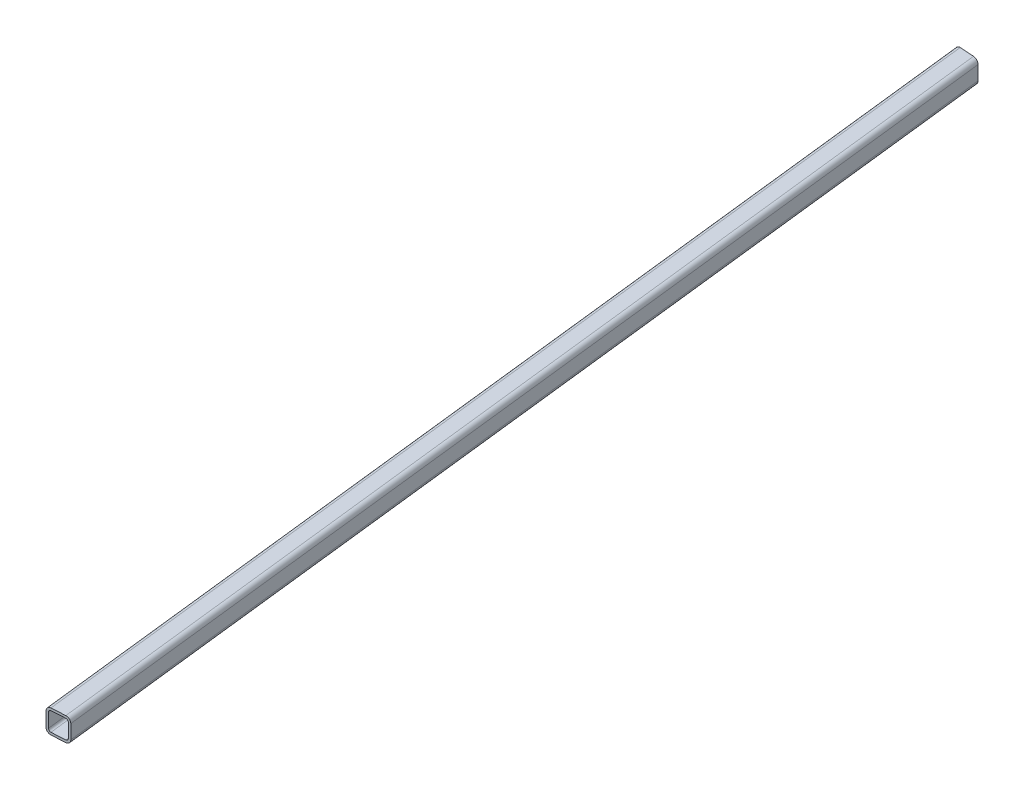
ISO-10303-21;
HEADER;
FILE_DESCRIPTION(('STEP AP214'),'2;1');
FILE_NAME('part.step','',(''),(''),'','','');
FILE_SCHEMA(('AUTOMOTIVE_DESIGN { 1 0 10303 214 1 1 1 1 }'));
ENDSEC;
DATA;
#1=APPLICATION_CONTEXT('core data for automotive mechanical design processes');
#2=APPLICATION_PROTOCOL_DEFINITION('international standard','automotive_design',2000,#1);
#3=PRODUCT_CONTEXT('',#1,'mechanical');
#4=PRODUCT('Part','Part','',(#3));
#5=PRODUCT_RELATED_PRODUCT_CATEGORY('part','',(#4));
#6=PRODUCT_DEFINITION_FORMATION('','',#4);
#7=PRODUCT_DEFINITION_CONTEXT('part definition',#1,'design');
#8=PRODUCT_DEFINITION('design','',#6,#7);
#9=PRODUCT_DEFINITION_SHAPE('','',#8);
#10=(LENGTH_UNIT() NAMED_UNIT(*) SI_UNIT(.MILLI.,.METRE.));
#11=(NAMED_UNIT(*) PLANE_ANGLE_UNIT() SI_UNIT($,.RADIAN.));
#12=(NAMED_UNIT(*) SI_UNIT($,.STERADIAN.) SOLID_ANGLE_UNIT());
#13=UNCERTAINTY_MEASURE_WITH_UNIT(LENGTH_MEASURE(1.E-05),#10,'distance_accuracy_value','');
#14=(GEOMETRIC_REPRESENTATION_CONTEXT(3) GLOBAL_UNCERTAINTY_ASSIGNED_CONTEXT((#13)) GLOBAL_UNIT_ASSIGNED_CONTEXT((#10,
#11,#12)) REPRESENTATION_CONTEXT('',''));
#15=CARTESIAN_POINT('',(0.,0.,0.));
#16=DIRECTION('',(0.,0.,1.));
#17=DIRECTION('',(1.,0.,0.));
#18=AXIS2_PLACEMENT_3D('',#15,#16,#17);
#19=CARTESIAN_POINT('',(-255.961196035939,6.00000000000001,-1699.31872045304));
#20=DIRECTION('',(0.113546591160732,0.,0.993532672656404));
#21=DIRECTION('',(0.993532672656404,0.,-0.113546591160732));
#22=AXIS2_PLACEMENT_3D('',#19,#20,#21);
#23=CYLINDRICAL_SURFACE('',#22,4.);
#24=CARTESIAN_POINT('',(-156.,6.00000000000001,-824.658255138574));
#25=DIRECTION('',(0.056865311674147,0.,0.998381858973911));
#26=DIRECTION('',(0.998381858973911,0.,-0.056865311674147));
#27=AXIS2_PLACEMENT_3D('',#24,#25,#26);
#28=ELLIPSE('',#27,4.00648305460098,4.);
#29=CARTESIAN_POINT('',(-156.,10.,-824.658255138574));
#30=VERTEX_POINT('',#29);
#31=CARTESIAN_POINT('',(-160.,6.,-824.430425230957));
#32=VERTEX_POINT('',#31);
#33=EDGE_CURVE('E185',#30,#32,#28,.T.);
#34=ORIENTED_EDGE('',*,*,#33,.F.);
#35=DIRECTION('',(0.113546591160732,0.,0.993532672656404));
#36=VECTOR('',#35,1.);
#37=CARTESIAN_POINT('',(-255.961196035939,10.,-1699.31872045304));
#38=LINE('',#37,#36);
#39=CARTESIAN_POINT('',(-256.084735577657,10.,-1700.39969144308));
#40=VERTEX_POINT('',#39);
#41=EDGE_CURVE('E265',#40,#30,#38,.T.);
#42=ORIENTED_EDGE('',*,*,#41,.F.);
#43=CARTESIAN_POINT('',(-256.084735577657,6.00000000000001,-1700.39969144308));
#44=DIRECTION('',(0.0655463023942974,0.,-0.997849528858152));
#45=DIRECTION('',(0.997849528858152,0.,0.0655463023942974));
#46=AXIS2_PLACEMENT_3D('',#43,#44,#45);
#47=ELLIPSE('',#46,4.06523255038944,4.);
#48=CARTESIAN_POINT('',(-260.141225962762,6.,-1700.66615240513));
#49=VERTEX_POINT('',#48);
#50=EDGE_CURVE('E176',#49,#40,#47,.T.);
#51=ORIENTED_EDGE('',*,*,#50,.F.);
#52=DIRECTION('',(0.113546591160732,0.,0.993532672656404));
#53=VECTOR('',#52,1.);
#54=CARTESIAN_POINT('',(-259.935326726564,6.00000000000001,-1698.86453408839));
#55=LINE('',#54,#53);
#56=EDGE_CURVE('E45',#49,#32,#55,.T.);
#57=ORIENTED_EDGE('',*,*,#56,.T.);
#58=EDGE_LOOP('',(#34,#42,#51,#57));
#59=FACE_BOUND('',#58,.T.);
#60=ADVANCED_FACE('F41',(#59),#23,.T.);
#61=CARTESIAN_POINT('',(-255.961196035939,10.,-1699.31872045304));
#62=DIRECTION('',(0.,-1.,0.));
#63=DIRECTION('',(0.,0.,-1.));
#64=AXIS2_PLACEMENT_3D('',#61,#62,#63);
#65=PLANE('',#64);
#66=DIRECTION('',(-0.998381858973911,0.,0.056865311674147));
#67=VECTOR('',#66,1.);
#68=CARTESIAN_POINT('',(-205.980598017969,10.,-821.811486381304));
#69=LINE('',#68,#67);
#70=CARTESIAN_POINT('',(-144.,10.,-825.341744861426));
#71=VERTEX_POINT('',#70);
#72=EDGE_CURVE('E182',#71,#30,#69,.T.);
#73=ORIENTED_EDGE('',*,*,#72,.F.);
#74=DIRECTION('',(0.113546591160732,0.,0.993532672656404));
#75=VECTOR('',#74,1.);
#76=CARTESIAN_POINT('',(-244.038803964062,10.,-1700.68127954697));
#77=LINE('',#76,#75);
#78=CARTESIAN_POINT('',(-243.915264422343,10.,-1699.60030855692));
#79=VERTEX_POINT('',#78);
#80=EDGE_CURVE('E263',#79,#71,#77,.T.);
#81=ORIENTED_EDGE('',*,*,#80,.F.);
#82=DIRECTION('',(0.997849528858152,0.,0.0655463023942974));
#83=VECTOR('',#82,1.);
#84=CARTESIAN_POINT('',(-255.891025518405,10.,-1700.38696710163));
#85=LINE('',#84,#83);
#86=EDGE_CURVE('E281',#40,#79,#85,.T.);
#87=ORIENTED_EDGE('',*,*,#86,.F.);
#88=ORIENTED_EDGE('',*,*,#41,.T.);
#89=EDGE_LOOP('',(#73,#81,#87,#88));
#90=FACE_BOUND('',#89,.T.);
#91=ADVANCED_FACE('F272',(#90),#65,.F.);
#92=CARTESIAN_POINT('',(-244.038803964062,6.00000000000001,-1700.68127954697));
#93=DIRECTION('',(0.113546591160732,0.,0.993532672656404));
#94=DIRECTION('',(0.993532672656404,0.,-0.113546591160732));
#95=AXIS2_PLACEMENT_3D('',#92,#93,#94);
#96=CYLINDRICAL_SURFACE('',#95,4.);
#97=CARTESIAN_POINT('',(-144.,6.00000000000001,-825.341744861426));
#98=DIRECTION('',(0.056865311674147,0.,0.998381858973911));
#99=DIRECTION('',(0.998381858973911,0.,-0.056865311674147));
#100=AXIS2_PLACEMENT_3D('',#97,#98,#99);
#101=ELLIPSE('',#100,4.00648305460098,4.);
#102=CARTESIAN_POINT('',(-140.,6.00000000000001,-825.569574769042));
#103=VERTEX_POINT('',#102);
#104=EDGE_CURVE('E11',#103,#71,#101,.T.);
#105=ORIENTED_EDGE('',*,*,#104,.F.);
#106=DIRECTION('',(0.113546591160732,0.,0.993532672656404));
#107=VECTOR('',#106,1.);
#108=CARTESIAN_POINT('',(-240.064673273436,6.00000000000001,-1701.13546591161));
#109=LINE('',#108,#107);
#110=CARTESIAN_POINT('',(-239.858774037238,6.00000000000001,-1699.33384759487));
#111=VERTEX_POINT('',#110);
#112=EDGE_CURVE('E260',#111,#103,#109,.T.);
#113=ORIENTED_EDGE('',*,*,#112,.F.);
#114=CARTESIAN_POINT('',(-243.915264422343,6.00000000000001,-1699.60030855692));
#115=DIRECTION('',(0.0655463023942974,0.,-0.997849528858152));
#116=DIRECTION('',(0.997849528858152,0.,0.0655463023942974));
#117=AXIS2_PLACEMENT_3D('',#114,#115,#116);
#118=ELLIPSE('',#117,4.06523255038944,4.);
#119=EDGE_CURVE('E278',#79,#111,#118,.T.);
#120=ORIENTED_EDGE('',*,*,#119,.F.);
#121=ORIENTED_EDGE('',*,*,#80,.T.);
#122=EDGE_LOOP('',(#105,#113,#120,#121));
#123=FACE_BOUND('',#122,.T.);
#124=ADVANCED_FACE('F275',(#123),#96,.T.);
#125=CARTESIAN_POINT('',(-240.064673273436,-6.00000000000001,-1701.13546591161));
#126=DIRECTION('',(-0.993532672656404,0.,0.113546591160732));
#127=DIRECTION('',(0.113546591160732,0.,0.993532672656404));
#128=AXIS2_PLACEMENT_3D('',#125,#126,#127);
#129=PLANE('',#128);
#130=DIRECTION('',(0.,1.,0.));
#131=VECTOR('',#130,1.);
#132=CARTESIAN_POINT('',(-140.,-6.,-825.569574769043));
#133=LINE('',#132,#131);
#134=CARTESIAN_POINT('',(-140.,-6.,-825.569574769043));
#135=VERTEX_POINT('',#134);
#136=EDGE_CURVE('E51',#135,#103,#133,.T.);
#137=ORIENTED_EDGE('',*,*,#136,.F.);
#138=DIRECTION('',(0.113546591160732,0.,0.993532672656404));
#139=VECTOR('',#138,1.);
#140=CARTESIAN_POINT('',(-240.064673273436,-6.00000000000001,-1701.13546591161));
#141=LINE('',#140,#139);
#142=CARTESIAN_POINT('',(-239.858774037238,-6.00000000000001,-1699.33384759487));
#143=VERTEX_POINT('',#142);
#144=EDGE_CURVE('E257',#143,#135,#141,.T.);
#145=ORIENTED_EDGE('',*,*,#144,.F.);
#146=DIRECTION('',(0.,-1.,0.));
#147=VECTOR('',#146,1.);
#148=CARTESIAN_POINT('',(-239.858774037238,-6.00000000000001,-1699.33384759487));
#149=LINE('',#148,#147);
#150=EDGE_CURVE('E280',#111,#143,#149,.T.);
#151=ORIENTED_EDGE('',*,*,#150,.F.);
#152=ORIENTED_EDGE('',*,*,#112,.T.);
#153=EDGE_LOOP('',(#137,#145,#151,#152));
#154=FACE_BOUND('',#153,.T.);
#155=ADVANCED_FACE('F291',(#154),#129,.F.);
#156=CARTESIAN_POINT('',(-244.038803964062,-6.00000000000001,-1700.68127954697));
#157=DIRECTION('',(0.113546591160732,0.,0.993532672656404));
#158=DIRECTION('',(0.993532672656404,0.,-0.113546591160732));
#159=AXIS2_PLACEMENT_3D('',#156,#157,#158);
#160=CYLINDRICAL_SURFACE('',#159,4.);
#161=CARTESIAN_POINT('',(-144.,-6.00000000000001,-825.341744861426));
#162=DIRECTION('',(0.056865311674147,0.,0.998381858973911));
#163=DIRECTION('',(0.998381858973911,0.,-0.056865311674147));
#164=AXIS2_PLACEMENT_3D('',#161,#162,#163);
#165=ELLIPSE('',#164,4.00648305460098,4.);
#166=CARTESIAN_POINT('',(-144.,-10.,-825.341744861426));
#167=VERTEX_POINT('',#166);
#168=EDGE_CURVE('E200',#167,#135,#165,.T.);
#169=ORIENTED_EDGE('',*,*,#168,.F.);
#170=DIRECTION('',(0.113546591160732,0.,0.993532672656404));
#171=VECTOR('',#170,1.);
#172=CARTESIAN_POINT('',(-244.038803964062,-10.,-1700.68127954697));
#173=LINE('',#172,#171);
#174=CARTESIAN_POINT('',(-243.915264422343,-10.,-1699.60030855692));
#175=VERTEX_POINT('',#174);
#176=EDGE_CURVE('E254',#175,#167,#173,.T.);
#177=ORIENTED_EDGE('',*,*,#176,.F.);
#178=CARTESIAN_POINT('',(-243.915264422343,-6.,-1699.60030855692));
#179=DIRECTION('',(0.0655463023942974,0.,-0.997849528858152));
#180=DIRECTION('',(0.997849528858152,0.,0.0655463023942974));
#181=AXIS2_PLACEMENT_3D('',#178,#179,#180);
#182=ELLIPSE('',#181,4.06523255038944,4.);
#183=EDGE_CURVE('E187',#143,#175,#182,.T.);
#184=ORIENTED_EDGE('',*,*,#183,.F.);
#185=ORIENTED_EDGE('',*,*,#144,.T.);
#186=EDGE_LOOP('',(#169,#177,#184,#185));
#187=FACE_BOUND('',#186,.T.);
#188=ADVANCED_FACE('F289',(#187),#160,.T.);
#189=CARTESIAN_POINT('',(-244.038803964062,-10.,-1700.68127954697));
#190=DIRECTION('',(0.,1.,0.));
#191=DIRECTION('',(0.,0.,1.));
#192=AXIS2_PLACEMENT_3D('',#189,#190,#191);
#193=PLANE('',#192);
#194=DIRECTION('',(0.998381858973911,0.,-0.056865311674147));
#195=VECTOR('',#194,1.);
#196=CARTESIAN_POINT('',(-194.019401982031,-10.,-822.492765928269));
#197=LINE('',#196,#195);
#198=CARTESIAN_POINT('',(-156.,-10.,-824.658255138574));
#199=VERTEX_POINT('',#198);
#200=EDGE_CURVE('E203',#199,#167,#197,.T.);
#201=ORIENTED_EDGE('',*,*,#200,.F.);
#202=DIRECTION('',(0.113546591160732,0.,0.993532672656404));
#203=VECTOR('',#202,1.);
#204=CARTESIAN_POINT('',(-255.961196035939,-10.,-1699.31872045304));
#205=LINE('',#204,#203);
#206=CARTESIAN_POINT('',(-256.084735577657,-10.,-1700.39969144308));
#207=VERTEX_POINT('',#206);
#208=EDGE_CURVE('E252',#207,#199,#205,.T.);
#209=ORIENTED_EDGE('',*,*,#208,.F.);
#210=DIRECTION('',(-0.997849528858152,0.,-0.0655463023942974));
#211=VECTOR('',#210,1.);
#212=CARTESIAN_POINT('',(-244.108974481595,-10.,-1699.61303289837));
#213=LINE('',#212,#211);
#214=EDGE_CURVE('E181',#175,#207,#213,.T.);
#215=ORIENTED_EDGE('',*,*,#214,.F.);
#216=ORIENTED_EDGE('',*,*,#176,.T.);
#217=EDGE_LOOP('',(#201,#209,#215,#216));
#218=FACE_BOUND('',#217,.T.);
#219=ADVANCED_FACE('F293',(#218),#193,.F.);
#220=CARTESIAN_POINT('',(-255.961196035939,-6.00000000000001,-1699.31872045304));
#221=DIRECTION('',(0.113546591160732,0.,0.993532672656404));
#222=DIRECTION('',(0.993532672656404,0.,-0.113546591160732));
#223=AXIS2_PLACEMENT_3D('',#220,#221,#222);
#224=CYLINDRICAL_SURFACE('',#223,4.);
#225=CARTESIAN_POINT('',(-156.,-6.00000000000001,-824.658255138574));
#226=DIRECTION('',(0.056865311674147,0.,0.998381858973911));
#227=DIRECTION('',(0.998381858973911,0.,-0.056865311674147));
#228=AXIS2_PLACEMENT_3D('',#225,#226,#227);
#229=ELLIPSE('',#228,4.00648305460098,4.);
#230=CARTESIAN_POINT('',(-160.,-6.00000000000001,-824.430425230957));
#231=VERTEX_POINT('',#230);
#232=EDGE_CURVE('E164',#231,#199,#229,.T.);
#233=ORIENTED_EDGE('',*,*,#232,.F.);
#234=DIRECTION('',(0.113546591160732,0.,0.993532672656404));
#235=VECTOR('',#234,1.);
#236=CARTESIAN_POINT('',(-259.935326726564,-6.00000000000001,-1698.86453408839));
#237=LINE('',#236,#235);
#238=CARTESIAN_POINT('',(-260.141225962762,-6.00000000000001,-1700.66615240513));
#239=VERTEX_POINT('',#238);
#240=EDGE_CURVE('E156',#239,#231,#237,.T.);
#241=ORIENTED_EDGE('',*,*,#240,.F.);
#242=CARTESIAN_POINT('',(-256.084735577657,-6.00000000000001,-1700.39969144308));
#243=DIRECTION('',(0.0655463023942974,0.,-0.997849528858152));
#244=DIRECTION('',(0.997849528858152,0.,0.0655463023942974));
#245=AXIS2_PLACEMENT_3D('',#242,#243,#244);
#246=ELLIPSE('',#245,4.06523255038944,4.);
#247=EDGE_CURVE('E161',#207,#239,#246,.T.);
#248=ORIENTED_EDGE('',*,*,#247,.F.);
#249=ORIENTED_EDGE('',*,*,#208,.T.);
#250=EDGE_LOOP('',(#233,#241,#248,#249));
#251=FACE_BOUND('',#250,.T.);
#252=ADVANCED_FACE('F158',(#251),#224,.T.);
#253=CARTESIAN_POINT('',(-244.038803964062,6.00000000000001,-1700.68127954697));
#254=DIRECTION('',(0.113546591160732,0.,0.993532672656404));
#255=DIRECTION('',(0.993532672656404,0.,-0.113546591160732));
#256=AXIS2_PLACEMENT_3D('',#253,#254,#255);
#257=CYLINDRICAL_SURFACE('',#256,2.);
#258=DIRECTION('',(0.113546591160732,0.,0.993532672656404));
#259=VECTOR('',#258,1.);
#260=CARTESIAN_POINT('',(-242.051738618749,6.00000000000001,-1700.90837272929));
#261=LINE('',#260,#259);
#262=CARTESIAN_POINT('',(-241.88701922979,6.,-1699.4670780759));
#263=VERTEX_POINT('',#262);
#264=CARTESIAN_POINT('',(-142.,6.00000000000001,-825.455659815234));
#265=VERTEX_POINT('',#264);
#266=EDGE_CURVE('E209',#263,#265,#261,.T.);
#267=ORIENTED_EDGE('',*,*,#266,.T.);
#268=CARTESIAN_POINT('',(-144.,6.00000000000001,-825.341744861426));
#269=DIRECTION('',(0.056865311674147,0.,0.998381858973911));
#270=DIRECTION('',(0.998381858973911,0.,-0.056865311674147));
#271=AXIS2_PLACEMENT_3D('',#268,#269,#270);
#272=ELLIPSE('',#271,2.00324152730049,2.);
#273=CARTESIAN_POINT('',(-144.,8.00000000000001,-825.341744861426));
#274=VERTEX_POINT('',#273);
#275=EDGE_CURVE('E87',#265,#274,#272,.T.);
#276=ORIENTED_EDGE('',*,*,#275,.T.);
#277=DIRECTION('',(0.113546591160732,0.,0.993532672656404));
#278=VECTOR('',#277,1.);
#279=CARTESIAN_POINT('',(-244.038803964062,8.00000000000001,-1700.68127954697));
#280=LINE('',#279,#278);
#281=CARTESIAN_POINT('',(-243.915264422343,8.00000000000001,-1699.60030855692));
#282=VERTEX_POINT('',#281);
#283=EDGE_CURVE('E212',#282,#274,#280,.T.);
#284=ORIENTED_EDGE('',*,*,#283,.F.);
#285=CARTESIAN_POINT('',(-243.915264422343,6.00000000000001,-1699.60030855692));
#286=DIRECTION('',(0.0655463023942974,0.,-0.997849528858152));
#287=DIRECTION('',(0.997849528858152,0.,0.0655463023942974));
#288=AXIS2_PLACEMENT_3D('',#285,#286,#287);
#289=ELLIPSE('',#288,2.03261627519472,2.);
#290=EDGE_CURVE('E208',#282,#263,#289,.T.);
#291=ORIENTED_EDGE('',*,*,#290,.T.);
#292=EDGE_LOOP('',(#267,#276,#284,#291));
#293=FACE_BOUND('',#292,.T.);
#294=ADVANCED_FACE('F300',(#293),#257,.F.);
#295=CARTESIAN_POINT('',(-255.961196035939,8.00000000000001,-1699.31872045304));
#296=DIRECTION('',(0.,-1.,0.));
#297=DIRECTION('',(0.,0.,-1.));
#298=AXIS2_PLACEMENT_3D('',#295,#296,#297);
#299=PLANE('',#298);
#300=ORIENTED_EDGE('',*,*,#283,.T.);
#301=DIRECTION('',(-0.998381858973911,0.,0.056865311674147));
#302=VECTOR('',#301,1.);
#303=CARTESIAN_POINT('',(-205.980598017969,8.00000000000001,-821.811486381304));
#304=LINE('',#303,#302);
#305=CARTESIAN_POINT('',(-156.,8.00000000000001,-824.658255138574));
#306=VERTEX_POINT('',#305);
#307=EDGE_CURVE('E60',#274,#306,#304,.T.);
#308=ORIENTED_EDGE('',*,*,#307,.T.);
#309=DIRECTION('',(0.113546591160732,0.,0.993532672656404));
#310=VECTOR('',#309,1.);
#311=CARTESIAN_POINT('',(-255.961196035939,8.00000000000001,-1699.31872045304));
#312=LINE('',#311,#310);
#313=CARTESIAN_POINT('',(-256.084735577657,8.00000000000001,-1700.39969144308));
#314=VERTEX_POINT('',#313);
#315=EDGE_CURVE('E217',#314,#306,#312,.T.);
#316=ORIENTED_EDGE('',*,*,#315,.F.);
#317=DIRECTION('',(0.997849528858152,0.,0.0655463023942974));
#318=VECTOR('',#317,1.);
#319=CARTESIAN_POINT('',(-255.891025518405,8.00000000000001,-1700.38696710163));
#320=LINE('',#319,#318);
#321=EDGE_CURVE('E211',#314,#282,#320,.T.);
#322=ORIENTED_EDGE('',*,*,#321,.T.);
#323=EDGE_LOOP('',(#300,#308,#316,#322));
#324=FACE_BOUND('',#323,.T.);
#325=ADVANCED_FACE('F342',(#324),#299,.T.);
#326=CARTESIAN_POINT('',(-255.961196035939,6.00000000000001,-1699.31872045304));
#327=DIRECTION('',(0.113546591160732,0.,0.993532672656404));
#328=DIRECTION('',(0.993532672656404,0.,-0.113546591160732));
#329=AXIS2_PLACEMENT_3D('',#326,#327,#328);
#330=CYLINDRICAL_SURFACE('',#329,2.);
#331=ORIENTED_EDGE('',*,*,#315,.T.);
#332=CARTESIAN_POINT('',(-156.,6.00000000000001,-824.658255138574));
#333=DIRECTION('',(0.056865311674147,0.,0.998381858973911));
#334=DIRECTION('',(0.998381858973911,0.,-0.056865311674147));
#335=AXIS2_PLACEMENT_3D('',#332,#333,#334);
#336=ELLIPSE('',#335,2.00324152730049,2.);
#337=CARTESIAN_POINT('',(-158.,6.00000000000001,-824.544340184766));
#338=VERTEX_POINT('',#337);
#339=EDGE_CURVE('E213',#306,#338,#336,.T.);
#340=ORIENTED_EDGE('',*,*,#339,.T.);
#341=DIRECTION('',(0.113546591160732,0.,0.993532672656404));
#342=VECTOR('',#341,1.);
#343=CARTESIAN_POINT('',(-257.948261381251,6.00000000000001,-1699.09162727071));
#344=LINE('',#343,#342);
#345=CARTESIAN_POINT('',(-258.11298077021,6.00000000000001,-1700.5329219241));
#346=VERTEX_POINT('',#345);
#347=EDGE_CURVE('E222',#346,#338,#344,.T.);
#348=ORIENTED_EDGE('',*,*,#347,.F.);
#349=CARTESIAN_POINT('',(-256.084735577657,6.00000000000001,-1700.39969144308));
#350=DIRECTION('',(0.0655463023942974,0.,-0.997849528858152));
#351=DIRECTION('',(0.997849528858152,0.,0.0655463023942974));
#352=AXIS2_PLACEMENT_3D('',#349,#350,#351);
#353=ELLIPSE('',#352,2.03261627519472,2.);
#354=EDGE_CURVE('E216',#346,#314,#353,.T.);
#355=ORIENTED_EDGE('',*,*,#354,.T.);
#356=EDGE_LOOP('',(#331,#340,#348,#355));
#357=FACE_BOUND('',#356,.T.);
#358=ADVANCED_FACE('F352',(#357),#330,.F.);
#359=CARTESIAN_POINT('',(-257.948261381251,6.00000000000001,-1699.09162727071));
#360=DIRECTION('',(0.993532672656404,0.,-0.113546591160732));
#361=DIRECTION('',(-0.113546591160732,0.,-0.993532672656404));
#362=AXIS2_PLACEMENT_3D('',#359,#360,#361);
#363=PLANE('',#362);
#364=ORIENTED_EDGE('',*,*,#347,.T.);
#365=DIRECTION('',(0.,-1.,0.));
#366=VECTOR('',#365,1.);
#367=CARTESIAN_POINT('',(-158.,6.00000000000001,-824.544340184766));
#368=LINE('',#367,#366);
#369=CARTESIAN_POINT('',(-158.,-6.00000000000001,-824.544340184766));
#370=VERTEX_POINT('',#369);
#371=EDGE_CURVE('E218',#338,#370,#368,.T.);
#372=ORIENTED_EDGE('',*,*,#371,.T.);
#373=DIRECTION('',(0.113546591160732,0.,0.993532672656404));
#374=VECTOR('',#373,1.);
#375=CARTESIAN_POINT('',(-257.948261381251,-6.00000000000001,-1699.09162727071));
#376=LINE('',#375,#374);
#377=CARTESIAN_POINT('',(-258.11298077021,-6.00000000000001,-1700.5329219241));
#378=VERTEX_POINT('',#377);
#379=EDGE_CURVE('E227',#378,#370,#376,.T.);
#380=ORIENTED_EDGE('',*,*,#379,.F.);
#381=DIRECTION('',(0.,1.,0.));
#382=VECTOR('',#381,1.);
#383=CARTESIAN_POINT('',(-258.11298077021,6.00000000000001,-1700.5329219241));
#384=LINE('',#383,#382);
#385=EDGE_CURVE('E221',#378,#346,#384,.T.);
#386=ORIENTED_EDGE('',*,*,#385,.T.);
#387=EDGE_LOOP('',(#364,#372,#380,#386));
#388=FACE_BOUND('',#387,.T.);
#389=ADVANCED_FACE('F362',(#388),#363,.T.);
#390=CARTESIAN_POINT('',(-255.961196035939,-6.00000000000001,-1699.31872045304));
#391=DIRECTION('',(0.113546591160732,0.,0.993532672656404));
#392=DIRECTION('',(0.993532672656404,0.,-0.113546591160732));
#393=AXIS2_PLACEMENT_3D('',#390,#391,#392);
#394=CYLINDRICAL_SURFACE('',#393,2.);
#395=ORIENTED_EDGE('',*,*,#379,.T.);
#396=CARTESIAN_POINT('',(-156.,-6.00000000000001,-824.658255138574));
#397=DIRECTION('',(0.056865311674147,0.,0.998381858973911));
#398=DIRECTION('',(0.998381858973911,0.,-0.056865311674147));
#399=AXIS2_PLACEMENT_3D('',#396,#397,#398);
#400=ELLIPSE('',#399,2.00324152730049,2.);
#401=CARTESIAN_POINT('',(-156.,-8.00000000000001,-824.658255138574));
#402=VERTEX_POINT('',#401);
#403=EDGE_CURVE('E223',#370,#402,#400,.T.);
#404=ORIENTED_EDGE('',*,*,#403,.T.);
#405=DIRECTION('',(0.113546591160732,0.,0.993532672656404));
#406=VECTOR('',#405,1.);
#407=CARTESIAN_POINT('',(-255.961196035939,-8.00000000000001,-1699.31872045304));
#408=LINE('',#407,#406);
#409=CARTESIAN_POINT('',(-256.084735577657,-8.00000000000001,-1700.39969144308));
#410=VERTEX_POINT('',#409);
#411=EDGE_CURVE('E232',#410,#402,#408,.T.);
#412=ORIENTED_EDGE('',*,*,#411,.F.);
#413=CARTESIAN_POINT('',(-256.084735577657,-6.00000000000001,-1700.39969144308));
#414=DIRECTION('',(0.0655463023942974,0.,-0.997849528858152));
#415=DIRECTION('',(0.997849528858152,0.,0.0655463023942974));
#416=AXIS2_PLACEMENT_3D('',#413,#414,#415);
#417=ELLIPSE('',#416,2.03261627519472,2.);
#418=EDGE_CURVE('E226',#410,#378,#417,.T.);
#419=ORIENTED_EDGE('',*,*,#418,.T.);
#420=EDGE_LOOP('',(#395,#404,#412,#419));
#421=FACE_BOUND('',#420,.T.);
#422=ADVANCED_FACE('F372',(#421),#394,.F.);
#423=CARTESIAN_POINT('',(-244.038803964062,-8.00000000000001,-1700.68127954697));
#424=DIRECTION('',(0.,1.,0.));
#425=DIRECTION('',(0.,0.,1.));
#426=AXIS2_PLACEMENT_3D('',#423,#424,#425);
#427=PLANE('',#426);
#428=ORIENTED_EDGE('',*,*,#411,.T.);
#429=DIRECTION('',(0.998381858973911,0.,-0.056865311674147));
#430=VECTOR('',#429,1.);
#431=CARTESIAN_POINT('',(-194.019401982031,-8.00000000000001,-822.492765928269));
#432=LINE('',#431,#430);
#433=CARTESIAN_POINT('',(-144.,-8.00000000000001,-825.341744861426));
#434=VERTEX_POINT('',#433);
#435=EDGE_CURVE('E228',#402,#434,#432,.T.);
#436=ORIENTED_EDGE('',*,*,#435,.T.);
#437=DIRECTION('',(0.113546591160732,0.,0.993532672656404));
#438=VECTOR('',#437,1.);
#439=CARTESIAN_POINT('',(-244.038803964062,-8.00000000000001,-1700.68127954697));
#440=LINE('',#439,#438);
#441=CARTESIAN_POINT('',(-243.915264422343,-8.00000000000001,-1699.60030855692));
#442=VERTEX_POINT('',#441);
#443=EDGE_CURVE('E236',#442,#434,#440,.T.);
#444=ORIENTED_EDGE('',*,*,#443,.F.);
#445=DIRECTION('',(-0.997849528858152,0.,-0.0655463023942974));
#446=VECTOR('',#445,1.);
#447=CARTESIAN_POINT('',(-244.108974481595,-8.00000000000001,-1699.61303289837));
#448=LINE('',#447,#446);
#449=EDGE_CURVE('E231',#442,#410,#448,.T.);
#450=ORIENTED_EDGE('',*,*,#449,.T.);
#451=EDGE_LOOP('',(#428,#436,#444,#450));
#452=FACE_BOUND('',#451,.T.);
#453=ADVANCED_FACE('F382',(#452),#427,.T.);
#454=CARTESIAN_POINT('',(-244.038803964062,-6.00000000000001,-1700.68127954697));
#455=DIRECTION('',(0.113546591160732,0.,0.993532672656404));
#456=DIRECTION('',(0.993532672656404,0.,-0.113546591160732));
#457=AXIS2_PLACEMENT_3D('',#454,#455,#456);
#458=CYLINDRICAL_SURFACE('',#457,2.);
#459=ORIENTED_EDGE('',*,*,#443,.T.);
#460=CARTESIAN_POINT('',(-144.,-6.00000000000001,-825.341744861426));
#461=DIRECTION('',(0.056865311674147,0.,0.998381858973911));
#462=DIRECTION('',(0.998381858973911,0.,-0.056865311674147));
#463=AXIS2_PLACEMENT_3D('',#460,#461,#462);
#464=ELLIPSE('',#463,2.00324152730049,2.);
#465=CARTESIAN_POINT('',(-142.,-6.00000000000001,-825.455659815234));
#466=VERTEX_POINT('',#465);
#467=EDGE_CURVE('E233',#434,#466,#464,.T.);
#468=ORIENTED_EDGE('',*,*,#467,.T.);
#469=DIRECTION('',(0.113546591160732,0.,0.993532672656404));
#470=VECTOR('',#469,1.);
#471=CARTESIAN_POINT('',(-242.051738618749,-6.00000000000001,-1700.90837272929));
#472=LINE('',#471,#470);
#473=CARTESIAN_POINT('',(-241.88701922979,-6.00000000000001,-1699.4670780759));
#474=VERTEX_POINT('',#473);
#475=EDGE_CURVE('E194',#474,#466,#472,.T.);
#476=ORIENTED_EDGE('',*,*,#475,.F.);
#477=CARTESIAN_POINT('',(-243.915264422343,-6.,-1699.60030855692));
#478=DIRECTION('',(0.0655463023942974,0.,-0.997849528858152));
#479=DIRECTION('',(0.997849528858152,0.,0.0655463023942974));
#480=AXIS2_PLACEMENT_3D('',#477,#478,#479);
#481=ELLIPSE('',#480,2.03261627519472,2.);
#482=EDGE_CURVE('E235',#474,#442,#481,.T.);
#483=ORIENTED_EDGE('',*,*,#482,.T.);
#484=EDGE_LOOP('',(#459,#468,#476,#483));
#485=FACE_BOUND('',#484,.T.);
#486=ADVANCED_FACE('F392',(#485),#458,.F.);
#487=CARTESIAN_POINT('',(-242.051738618749,-6.00000000000001,-1700.90837272929));
#488=DIRECTION('',(-0.993532672656404,0.,0.113546591160732));
#489=DIRECTION('',(0.113546591160732,0.,0.993532672656404));
#490=AXIS2_PLACEMENT_3D('',#487,#488,#489);
#491=PLANE('',#490);
#492=ORIENTED_EDGE('',*,*,#475,.T.);
#493=DIRECTION('',(0.,1.,0.));
#494=VECTOR('',#493,1.);
#495=CARTESIAN_POINT('',(-142.,-6.00000000000001,-825.455659815234));
#496=LINE('',#495,#494);
#497=EDGE_CURVE('E82',#466,#265,#496,.T.);
#498=ORIENTED_EDGE('',*,*,#497,.T.);
#499=ORIENTED_EDGE('',*,*,#266,.F.);
#500=DIRECTION('',(0.,-1.,0.));
#501=VECTOR('',#500,1.);
#502=CARTESIAN_POINT('',(-241.88701922979,-6.00000000000001,-1699.4670780759));
#503=LINE('',#502,#501);
#504=EDGE_CURVE('E169',#263,#474,#503,.T.);
#505=ORIENTED_EDGE('',*,*,#504,.T.);
#506=EDGE_LOOP('',(#492,#498,#499,#505));
#507=FACE_BOUND('',#506,.T.);
#508=ADVANCED_FACE('F402',(#507),#491,.T.);
#509=CARTESIAN_POINT('',(-259.935326726564,6.00000000000001,-1698.86453408839));
#510=DIRECTION('',(0.993532672656404,0.,-0.113546591160732));
#511=DIRECTION('',(-0.113546591160732,0.,-0.993532672656404));
#512=AXIS2_PLACEMENT_3D('',#509,#510,#511);
#513=PLANE('',#512);
#514=DIRECTION('',(0.,-1.,0.));
#515=VECTOR('',#514,1.);
#516=CARTESIAN_POINT('',(-160.,6.,-824.430425230957));
#517=LINE('',#516,#515);
#518=EDGE_CURVE('E196',#32,#231,#517,.T.);
#519=ORIENTED_EDGE('',*,*,#518,.F.);
#520=ORIENTED_EDGE('',*,*,#56,.F.);
#521=DIRECTION('',(0.,1.,0.));
#522=VECTOR('',#521,1.);
#523=CARTESIAN_POINT('',(-260.141225962762,6.,-1700.66615240513));
#524=LINE('',#523,#522);
#525=EDGE_CURVE('E168',#239,#49,#524,.T.);
#526=ORIENTED_EDGE('',*,*,#525,.F.);
#527=ORIENTED_EDGE('',*,*,#240,.T.);
#528=EDGE_LOOP('',(#519,#520,#526,#527));
#529=FACE_BOUND('',#528,.T.);
#530=ADVANCED_FACE('F172',(#529),#513,.F.);
#531=CARTESIAN_POINT('',(-250.,0.,-1700.));
#532=DIRECTION('',(0.0655463023942974,0.,-0.997849528858152));
#533=DIRECTION('',(-0.997849528858152,0.,-0.0655463023942974));
#534=AXIS2_PLACEMENT_3D('',#531,#532,#533);
#535=PLANE('',#534);
#536=ORIENTED_EDGE('',*,*,#290,.F.);
#537=ORIENTED_EDGE('',*,*,#321,.F.);
#538=ORIENTED_EDGE('',*,*,#354,.F.);
#539=ORIENTED_EDGE('',*,*,#385,.F.);
#540=ORIENTED_EDGE('',*,*,#418,.F.);
#541=ORIENTED_EDGE('',*,*,#449,.F.);
#542=ORIENTED_EDGE('',*,*,#482,.F.);
#543=ORIENTED_EDGE('',*,*,#504,.F.);
#544=EDGE_LOOP('',(#536,#537,#538,#539,#540,#541,#542,#543));
#545=FACE_BOUND('',#544,.T.);
#546=ORIENTED_EDGE('',*,*,#525,.T.);
#547=ORIENTED_EDGE('',*,*,#50,.T.);
#548=ORIENTED_EDGE('',*,*,#86,.T.);
#549=ORIENTED_EDGE('',*,*,#119,.T.);
#550=ORIENTED_EDGE('',*,*,#150,.T.);
#551=ORIENTED_EDGE('',*,*,#183,.T.);
#552=ORIENTED_EDGE('',*,*,#214,.T.);
#553=ORIENTED_EDGE('',*,*,#247,.T.);
#554=EDGE_LOOP('',(#546,#547,#548,#549,#550,#551,#552,#553));
#555=FACE_BOUND('',#554,.T.);
#556=ADVANCED_FACE('F179',(#545,#555),#535,.T.);
#557=CARTESIAN_POINT('',(-150.,0.,-825.));
#558=DIRECTION('',(0.056865311674147,0.,0.998381858973911));
#559=DIRECTION('',(0.998381858973911,0.,-0.056865311674147));
#560=AXIS2_PLACEMENT_3D('',#557,#558,#559);
#561=PLANE('',#560);
#562=ORIENTED_EDGE('',*,*,#275,.F.);
#563=ORIENTED_EDGE('',*,*,#497,.F.);
#564=ORIENTED_EDGE('',*,*,#467,.F.);
#565=ORIENTED_EDGE('',*,*,#435,.F.);
#566=ORIENTED_EDGE('',*,*,#403,.F.);
#567=ORIENTED_EDGE('',*,*,#371,.F.);
#568=ORIENTED_EDGE('',*,*,#339,.F.);
#569=ORIENTED_EDGE('',*,*,#307,.F.);
#570=EDGE_LOOP('',(#562,#563,#564,#565,#566,#567,#568,#569));
#571=FACE_BOUND('',#570,.T.);
#572=ORIENTED_EDGE('',*,*,#72,.T.);
#573=ORIENTED_EDGE('',*,*,#33,.T.);
#574=ORIENTED_EDGE('',*,*,#518,.T.);
#575=ORIENTED_EDGE('',*,*,#232,.T.);
#576=ORIENTED_EDGE('',*,*,#200,.T.);
#577=ORIENTED_EDGE('',*,*,#168,.T.);
#578=ORIENTED_EDGE('',*,*,#136,.T.);
#579=ORIENTED_EDGE('',*,*,#104,.T.);
#580=EDGE_LOOP('',(#572,#573,#574,#575,#576,#577,#578,#579));
#581=FACE_BOUND('',#580,.T.);
#582=ADVANCED_FACE('F43',(#571,#581),#561,.T.);
#583=CLOSED_SHELL('',(#60,#91,#124,#155,#188,#219,#252,#294,#325,#358,#389,#422,#453,#486,#508,
#530,#556,#582));
#584=MANIFOLD_SOLID_BREP('B2',#583);
#585=ADVANCED_BREP_SHAPE_REPRESENTATION('',(#18,#584),#14);
#586=SHAPE_DEFINITION_REPRESENTATION(#9,#585);
ENDSEC;
END-ISO-10303-21;
